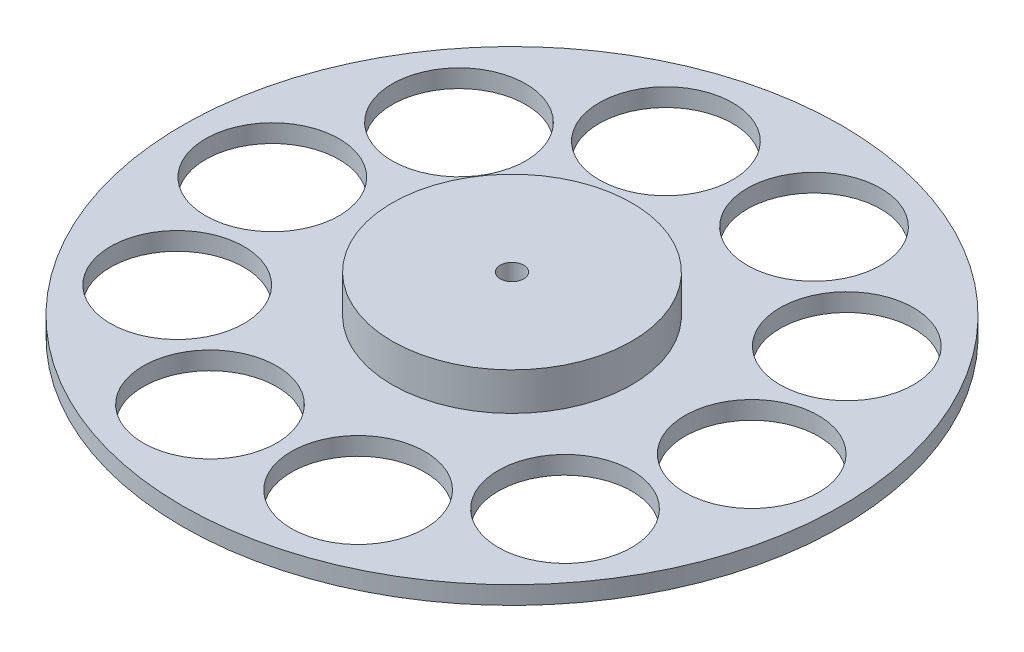
ISO-10303-21;
HEADER;
FILE_DESCRIPTION(('STEP AP214'),'2;1');
FILE_NAME('part.step','',(''),(''),'','','');
FILE_SCHEMA(('AUTOMOTIVE_DESIGN { 1 0 10303 214 1 1 1 1 }'));
ENDSEC;
DATA;
#1=APPLICATION_CONTEXT('core data for automotive mechanical design processes');
#2=APPLICATION_PROTOCOL_DEFINITION('international standard','automotive_design',2000,#1);
#3=PRODUCT_CONTEXT('',#1,'mechanical');
#4=PRODUCT('Part','Part','',(#3));
#5=PRODUCT_RELATED_PRODUCT_CATEGORY('part','',(#4));
#6=PRODUCT_DEFINITION_FORMATION('','',#4);
#7=PRODUCT_DEFINITION_CONTEXT('part definition',#1,'design');
#8=PRODUCT_DEFINITION('design','',#6,#7);
#9=PRODUCT_DEFINITION_SHAPE('','',#8);
#10=(LENGTH_UNIT() NAMED_UNIT(*) SI_UNIT(.MILLI.,.METRE.));
#11=(NAMED_UNIT(*) PLANE_ANGLE_UNIT() SI_UNIT($,.RADIAN.));
#12=(NAMED_UNIT(*) SI_UNIT($,.STERADIAN.) SOLID_ANGLE_UNIT());
#13=UNCERTAINTY_MEASURE_WITH_UNIT(LENGTH_MEASURE(1.E-05),#10,'distance_accuracy_value','');
#14=(GEOMETRIC_REPRESENTATION_CONTEXT(3) GLOBAL_UNCERTAINTY_ASSIGNED_CONTEXT((#13)) GLOBAL_UNIT_ASSIGNED_CONTEXT((#10,
#11,#12)) REPRESENTATION_CONTEXT('',''));
#15=CARTESIAN_POINT('',(0.,0.,0.));
#16=DIRECTION('',(0.,0.,1.));
#17=DIRECTION('',(1.,0.,0.));
#18=AXIS2_PLACEMENT_3D('',#15,#16,#17);
#19=CARTESIAN_POINT('',(0.,3.81,0.));
#20=DIRECTION('',(0.,-1.,0.));
#21=DIRECTION('',(0.,0.,-1.));
#22=AXIS2_PLACEMENT_3D('',#19,#20,#21);
#23=CYLINDRICAL_SURFACE('',#22,69.85);
#24=CARTESIAN_POINT('',(0.,3.81,0.));
#25=DIRECTION('',(0.,1.,0.));
#26=DIRECTION('',(0.,0.,1.));
#27=AXIS2_PLACEMENT_3D('',#24,#25,#26);
#28=CIRCLE('',#27,69.85);
#29=CARTESIAN_POINT('',(0.,3.81,-69.85));
#30=VERTEX_POINT('',#29);
#31=EDGE_CURVE('E68',#30,#30,#28,.T.);
#32=CARTESIAN_POINT('',(0.,0.,0.));
#33=DIRECTION('',(0.,1.,0.));
#34=DIRECTION('',(0.,0.,1.));
#35=AXIS2_PLACEMENT_3D('',#32,#33,#34);
#36=CIRCLE('',#35,69.85);
#37=CARTESIAN_POINT('',(0.,0.,-69.85));
#38=VERTEX_POINT('',#37);
#39=EDGE_CURVE('E65',#38,#38,#36,.T.);
#40=CARTESIAN_POINT('',(0.,3.81,-69.85));
#41=CARTESIAN_POINT('',(0.,3.7703125,-69.85));
#42=CARTESIAN_POINT('',(0.,3.730625,-69.85));
#43=CARTESIAN_POINT('',(0.,3.65125,-69.85));
#44=CARTESIAN_POINT('',(0.,3.6115625,-69.85));
#45=CARTESIAN_POINT('',(0.,3.5321875,-69.85));
#46=CARTESIAN_POINT('',(0.,3.4925,-69.85));
#47=CARTESIAN_POINT('',(0.,3.413125,-69.85));
#48=CARTESIAN_POINT('',(0.,3.3734375,-69.85));
#49=CARTESIAN_POINT('',(0.,3.2940625,-69.85));
#50=CARTESIAN_POINT('',(0.,3.254375,-69.85));
#51=CARTESIAN_POINT('',(0.,3.175,-69.85));
#52=CARTESIAN_POINT('',(0.,3.1353125,-69.85));
#53=CARTESIAN_POINT('',(0.,3.0559375,-69.85));
#54=CARTESIAN_POINT('',(0.,3.01625,-69.85));
#55=CARTESIAN_POINT('',(0.,2.936875,-69.85));
#56=CARTESIAN_POINT('',(0.,2.8971875,-69.85));
#57=CARTESIAN_POINT('',(0.,2.8178125,-69.85));
#58=CARTESIAN_POINT('',(0.,2.778125,-69.85));
#59=CARTESIAN_POINT('',(0.,2.69875,-69.85));
#60=CARTESIAN_POINT('',(0.,2.6590625,-69.85));
#61=CARTESIAN_POINT('',(0.,2.5796875,-69.85));
#62=CARTESIAN_POINT('',(0.,2.54,-69.85));
#63=CARTESIAN_POINT('',(0.,2.460625,-69.85));
#64=CARTESIAN_POINT('',(0.,2.4209375,-69.85));
#65=CARTESIAN_POINT('',(0.,2.3415625,-69.85));
#66=CARTESIAN_POINT('',(0.,2.301875,-69.85));
#67=CARTESIAN_POINT('',(0.,2.2225,-69.85));
#68=CARTESIAN_POINT('',(0.,2.1828125,-69.85));
#69=CARTESIAN_POINT('',(0.,2.1034375,-69.85));
#70=CARTESIAN_POINT('',(0.,2.06375,-69.85));
#71=CARTESIAN_POINT('',(0.,1.984375,-69.85));
#72=CARTESIAN_POINT('',(0.,1.9446875,-69.85));
#73=CARTESIAN_POINT('',(0.,1.8653125,-69.85));
#74=CARTESIAN_POINT('',(0.,1.825625,-69.85));
#75=CARTESIAN_POINT('',(0.,1.74625,-69.85));
#76=CARTESIAN_POINT('',(0.,1.7065625,-69.85));
#77=CARTESIAN_POINT('',(0.,1.6271875,-69.85));
#78=CARTESIAN_POINT('',(0.,1.5875,-69.85));
#79=CARTESIAN_POINT('',(0.,1.508125,-69.85));
#80=CARTESIAN_POINT('',(0.,1.4684375,-69.85));
#81=CARTESIAN_POINT('',(0.,1.3890625,-69.85));
#82=CARTESIAN_POINT('',(0.,1.349375,-69.85));
#83=CARTESIAN_POINT('',(0.,1.27,-69.85));
#84=CARTESIAN_POINT('',(0.,1.2303125,-69.85));
#85=CARTESIAN_POINT('',(0.,1.1509375,-69.85));
#86=CARTESIAN_POINT('',(0.,1.11125,-69.85));
#87=CARTESIAN_POINT('',(0.,1.031875,-69.85));
#88=CARTESIAN_POINT('',(0.,0.9921875,-69.85));
#89=CARTESIAN_POINT('',(0.,0.9128125,-69.85));
#90=CARTESIAN_POINT('',(0.,0.873125,-69.85));
#91=CARTESIAN_POINT('',(0.,0.79375,-69.85));
#92=CARTESIAN_POINT('',(0.,0.7540625,-69.85));
#93=CARTESIAN_POINT('',(0.,0.6746875,-69.85));
#94=CARTESIAN_POINT('',(0.,0.635,-69.85));
#95=CARTESIAN_POINT('',(0.,0.555625,-69.85));
#96=CARTESIAN_POINT('',(0.,0.5159375,-69.85));
#97=CARTESIAN_POINT('',(0.,0.4365625,-69.85));
#98=CARTESIAN_POINT('',(0.,0.396875,-69.85));
#99=CARTESIAN_POINT('',(0.,0.3175,-69.85));
#100=CARTESIAN_POINT('',(0.,0.2778125,-69.85));
#101=CARTESIAN_POINT('',(0.,0.1984375,-69.85));
#102=CARTESIAN_POINT('',(0.,0.15875,-69.85));
#103=CARTESIAN_POINT('',(0.,0.0793749999999999,-69.85));
#104=CARTESIAN_POINT('',(0.,0.0396874999999999,-69.85));
#105=CARTESIAN_POINT('',(0.,0.,-69.85));
#106=B_SPLINE_CURVE_WITH_KNOTS('',3,(#40,#41,#42,#43,#44,#45,#46,#47,#48,#49,#50,#51,#52,#53,
#54,#55,#56,#57,#58,#59,#60,#61,#62,#63,#64,#65,#66,#67,#68,#69,#70,#71,#72,#73,#74,#75,#76,#77,
#78,#79,#80,#81,#82,#83,#84,#85,#86,#87,#88,#89,#90,#91,#92,#93,#94,#95,#96,#97,#98,#99,#100,
#101,#102,#103,#104,#105),.UNSPECIFIED.,.F.,.F.,(4,2,2,2,2,2,2,2,2,2,2,2,2,2,2,2,2,2,2,2,2,2,2,
2,2,2,2,2,2,2,2,2,4),(0.,0.1190625,0.238125,0.3571875,0.47625,0.5953125,0.714375,0.8334375,
0.9525,1.0715625,1.190625,1.3096875,1.42875,1.5478125,1.666875,1.7859375,1.905,2.0240625,
2.143125,2.2621875,2.38125,2.5003125,2.619375,2.7384375,2.8575,2.9765625,3.095625,3.2146875,
3.33375,3.4528125,3.571875,3.6909375,3.81),.UNSPECIFIED.);
#107=EDGE_CURVE('BSEAM35',#30,#38,#106,.T.);
#108=ORIENTED_EDGE('',*,*,#31,.F.);
#109=ORIENTED_EDGE('',*,*,#39,.T.);
#110=ORIENTED_EDGE('',*,*,#107,.T.);
#111=ORIENTED_EDGE('',*,*,#107,.F.);
#112=EDGE_LOOP('',(#108,#110,#109,#111));
#113=FACE_BOUND('',#112,.T.);
#114=ADVANCED_FACE('F35',(#113),#23,.T.);
#115=CARTESIAN_POINT('',(0.,3.81,0.));
#116=DIRECTION('',(0.,1.,0.));
#117=DIRECTION('',(0.,0.,1.));
#118=AXIS2_PLACEMENT_3D('',#115,#116,#117);
#119=PLANE('',#118);
#120=CARTESIAN_POINT('',(-50.8,3.81,0.));
#121=DIRECTION('',(0.,1.,0.));
#122=DIRECTION('',(0.,0.,1.));
#123=AXIS2_PLACEMENT_3D('',#120,#121,#122);
#124=CIRCLE('',#123,14.15);
#125=CARTESIAN_POINT('',(-50.8,3.81,14.15));
#126=VERTEX_POINT('',#125);
#127=EDGE_CURVE('E360',#126,#126,#124,.T.);
#128=ORIENTED_EDGE('',*,*,#127,.F.);
#129=EDGE_LOOP('',(#128));
#130=FACE_BOUND('',#129,.T.);
#131=CARTESIAN_POINT('',(-41.0980633142479,3.81,-29.8594908164589));
#132=DIRECTION('',(0.,1.,0.));
#133=DIRECTION('',(0.,0.,1.));
#134=AXIS2_PLACEMENT_3D('',#131,#132,#133);
#135=CIRCLE('',#134,14.15);
#136=CARTESIAN_POINT('',(-41.0980633142479,3.81,-15.7094908164588));
#137=VERTEX_POINT('',#136);
#138=EDGE_CURVE('E362',#137,#137,#135,.T.);
#139=ORIENTED_EDGE('',*,*,#138,.F.);
#140=EDGE_LOOP('',(#139));
#141=FACE_BOUND('',#140,.T.);
#142=CARTESIAN_POINT('',(-15.6980633142476,3.81,-48.3136710277963));
#143=DIRECTION('',(0.,1.,0.));
#144=DIRECTION('',(0.,0.,1.));
#145=AXIS2_PLACEMENT_3D('',#142,#143,#144);
#146=CIRCLE('',#145,14.15);
#147=CARTESIAN_POINT('',(-15.6980633142476,3.81,-34.1636710277963));
#148=VERTEX_POINT('',#147);
#149=EDGE_CURVE('E370',#148,#148,#146,.T.);
#150=ORIENTED_EDGE('',*,*,#149,.F.);
#151=EDGE_LOOP('',(#150));
#152=FACE_BOUND('',#151,.T.);
#153=CARTESIAN_POINT('',(15.6980633142481,3.81,-48.3136710277972));
#154=DIRECTION('',(0.,1.,0.));
#155=DIRECTION('',(0.,0.,1.));
#156=AXIS2_PLACEMENT_3D('',#153,#154,#155);
#157=CIRCLE('',#156,14.15);
#158=CARTESIAN_POINT('',(15.6980633142481,3.81,-34.1636710277972));
#159=VERTEX_POINT('',#158);
#160=EDGE_CURVE('E99',#159,#159,#157,.T.);
#161=ORIENTED_EDGE('',*,*,#160,.F.);
#162=EDGE_LOOP('',(#161));
#163=FACE_BOUND('',#162,.T.);
#164=CARTESIAN_POINT('',(41.0980633142494,3.81,-29.8594908164612));
#165=DIRECTION('',(0.,1.,0.));
#166=DIRECTION('',(0.,0.,1.));
#167=AXIS2_PLACEMENT_3D('',#164,#165,#166);
#168=CIRCLE('',#167,14.15);
#169=CARTESIAN_POINT('',(41.0980633142494,3.81,-15.7094908164612));
#170=VERTEX_POINT('',#169);
#171=EDGE_CURVE('E88',#170,#170,#168,.T.);
#172=ORIENTED_EDGE('',*,*,#171,.F.);
#173=EDGE_LOOP('',(#172));
#174=FACE_BOUND('',#173,.T.);
#175=CARTESIAN_POINT('',(50.8000000000032,3.81,-2.86576318231369E-12));
#176=DIRECTION('',(0.,1.,0.));
#177=DIRECTION('',(0.,0.,1.));
#178=AXIS2_PLACEMENT_3D('',#175,#176,#177);
#179=CIRCLE('',#178,14.15);
#180=CARTESIAN_POINT('',(50.8000000000032,3.81,14.1499999999971));
#181=VERTEX_POINT('',#180);
#182=EDGE_CURVE('E85',#181,#181,#179,.T.);
#183=ORIENTED_EDGE('',*,*,#182,.F.);
#184=EDGE_LOOP('',(#183));
#185=FACE_BOUND('',#184,.T.);
#186=CARTESIAN_POINT('',(41.0980633142511,3.81,29.859490816456));
#187=DIRECTION('',(0.,1.,0.));
#188=DIRECTION('',(0.,0.,1.));
#189=AXIS2_PLACEMENT_3D('',#186,#187,#188);
#190=CIRCLE('',#189,14.15);
#191=CARTESIAN_POINT('',(41.0980633142511,3.81,44.009490816456));
#192=VERTEX_POINT('',#191);
#193=EDGE_CURVE('E82',#192,#192,#190,.T.);
#194=ORIENTED_EDGE('',*,*,#193,.F.);
#195=EDGE_LOOP('',(#194));
#196=FACE_BOUND('',#195,.T.);
#197=CARTESIAN_POINT('',(15.6980633142508,3.81,48.3136710277935));
#198=DIRECTION('',(0.,1.,0.));
#199=DIRECTION('',(0.,0.,1.));
#200=AXIS2_PLACEMENT_3D('',#197,#198,#199);
#201=CIRCLE('',#200,14.15);
#202=CARTESIAN_POINT('',(15.6980633142508,3.81,62.4636710277935));
#203=VERTEX_POINT('',#202);
#204=EDGE_CURVE('E81',#203,#203,#201,.T.);
#205=ORIENTED_EDGE('',*,*,#204,.F.);
#206=EDGE_LOOP('',(#205));
#207=FACE_BOUND('',#206,.T.);
#208=CARTESIAN_POINT('',(-15.6980633142448,3.81,48.3136710277943));
#209=DIRECTION('',(0.,1.,0.));
#210=DIRECTION('',(0.,0.,1.));
#211=AXIS2_PLACEMENT_3D('',#208,#209,#210);
#212=CIRCLE('',#211,14.15);
#213=CARTESIAN_POINT('',(-15.6980633142448,3.81,62.4636710277944));
#214=VERTEX_POINT('',#213);
#215=EDGE_CURVE('E77',#214,#214,#212,.T.);
#216=ORIENTED_EDGE('',*,*,#215,.F.);
#217=EDGE_LOOP('',(#216));
#218=FACE_BOUND('',#217,.T.);
#219=CARTESIAN_POINT('',(-41.0980633142462,3.81,29.8594908164583));
#220=DIRECTION('',(0.,1.,0.));
#221=DIRECTION('',(0.,0.,1.));
#222=AXIS2_PLACEMENT_3D('',#219,#220,#221);
#223=CIRCLE('',#222,14.15);
#224=CARTESIAN_POINT('',(-41.0980633142462,3.81,44.0094908164583));
#225=VERTEX_POINT('',#224);
#226=EDGE_CURVE('E76',#225,#225,#223,.T.);
#227=ORIENTED_EDGE('',*,*,#226,.F.);
#228=EDGE_LOOP('',(#227));
#229=FACE_BOUND('',#228,.T.);
#230=CARTESIAN_POINT('',(0.,3.81,0.));
#231=DIRECTION('',(0.,1.,0.));
#232=DIRECTION('',(0.,0.,1.));
#233=AXIS2_PLACEMENT_3D('',#230,#231,#232);
#234=CIRCLE('',#233,25.4);
#235=CARTESIAN_POINT('',(0.,3.81,25.4));
#236=VERTEX_POINT('',#235);
#237=EDGE_CURVE('E47',#236,#236,#234,.T.);
#238=ORIENTED_EDGE('',*,*,#237,.F.);
#239=EDGE_LOOP('',(#238));
#240=FACE_BOUND('',#239,.T.);
#241=ORIENTED_EDGE('',*,*,#31,.T.);
#242=EDGE_LOOP('',(#241));
#243=FACE_BOUND('',#242,.T.);
#244=ADVANCED_FACE('F143',(#130,#141,#152,#163,#174,#185,#196,#207,#218,#229,#240,#243),#119,.T.);
#245=CARTESIAN_POINT('',(0.,0.,0.));
#246=DIRECTION('',(0.,1.,0.));
#247=DIRECTION('',(0.,0.,1.));
#248=AXIS2_PLACEMENT_3D('',#245,#246,#247);
#249=PLANE('',#248);
#250=CARTESIAN_POINT('',(-50.8,0.,0.));
#251=DIRECTION('',(0.,1.,0.));
#252=DIRECTION('',(0.,0.,1.));
#253=AXIS2_PLACEMENT_3D('',#250,#251,#252);
#254=CIRCLE('',#253,14.15);
#255=CARTESIAN_POINT('',(-50.8,0.,14.15));
#256=VERTEX_POINT('',#255);
#257=EDGE_CURVE('E38',#256,#256,#254,.T.);
#258=ORIENTED_EDGE('',*,*,#257,.T.);
#259=EDGE_LOOP('',(#258));
#260=FACE_BOUND('',#259,.T.);
#261=CARTESIAN_POINT('',(-41.0980633142479,0.,-29.8594908164589));
#262=DIRECTION('',(0.,1.,0.));
#263=DIRECTION('',(0.,0.,1.));
#264=AXIS2_PLACEMENT_3D('',#261,#262,#263);
#265=CIRCLE('',#264,14.15);
#266=CARTESIAN_POINT('',(-41.0980633142479,0.,-15.7094908164588));
#267=VERTEX_POINT('',#266);
#268=EDGE_CURVE('E364',#267,#267,#265,.T.);
#269=ORIENTED_EDGE('',*,*,#268,.T.);
#270=EDGE_LOOP('',(#269));
#271=FACE_BOUND('',#270,.T.);
#272=CARTESIAN_POINT('',(-15.6980633142476,0.,-48.3136710277963));
#273=DIRECTION('',(0.,1.,0.));
#274=DIRECTION('',(0.,0.,1.));
#275=AXIS2_PLACEMENT_3D('',#272,#273,#274);
#276=CIRCLE('',#275,14.15);
#277=CARTESIAN_POINT('',(-15.6980633142476,0.,-34.1636710277963));
#278=VERTEX_POINT('',#277);
#279=EDGE_CURVE('E373',#278,#278,#276,.T.);
#280=ORIENTED_EDGE('',*,*,#279,.T.);
#281=EDGE_LOOP('',(#280));
#282=FACE_BOUND('',#281,.T.);
#283=CARTESIAN_POINT('',(15.6980633142481,0.,-48.3136710277972));
#284=DIRECTION('',(0.,1.,0.));
#285=DIRECTION('',(0.,0.,1.));
#286=AXIS2_PLACEMENT_3D('',#283,#284,#285);
#287=CIRCLE('',#286,14.15);
#288=CARTESIAN_POINT('',(15.6980633142481,0.,-34.1636710277972));
#289=VERTEX_POINT('',#288);
#290=EDGE_CURVE('E94',#289,#289,#287,.T.);
#291=ORIENTED_EDGE('',*,*,#290,.T.);
#292=EDGE_LOOP('',(#291));
#293=FACE_BOUND('',#292,.T.);
#294=CARTESIAN_POINT('',(41.0980633142494,0.,-29.8594908164612));
#295=DIRECTION('',(0.,1.,0.));
#296=DIRECTION('',(0.,0.,1.));
#297=AXIS2_PLACEMENT_3D('',#294,#295,#296);
#298=CIRCLE('',#297,14.15);
#299=CARTESIAN_POINT('',(41.0980633142494,0.,-15.7094908164612));
#300=VERTEX_POINT('',#299);
#301=EDGE_CURVE('E86',#300,#300,#298,.T.);
#302=ORIENTED_EDGE('',*,*,#301,.T.);
#303=EDGE_LOOP('',(#302));
#304=FACE_BOUND('',#303,.T.);
#305=CARTESIAN_POINT('',(50.8000000000032,0.,-2.86576318231369E-12));
#306=DIRECTION('',(0.,1.,0.));
#307=DIRECTION('',(0.,0.,1.));
#308=AXIS2_PLACEMENT_3D('',#305,#306,#307);
#309=CIRCLE('',#308,14.15);
#310=CARTESIAN_POINT('',(50.8000000000032,0.,14.1499999999971));
#311=VERTEX_POINT('',#310);
#312=EDGE_CURVE('E83',#311,#311,#309,.T.);
#313=ORIENTED_EDGE('',*,*,#312,.T.);
#314=EDGE_LOOP('',(#313));
#315=FACE_BOUND('',#314,.T.);
#316=CARTESIAN_POINT('',(41.0980633142511,0.,29.859490816456));
#317=DIRECTION('',(0.,1.,0.));
#318=DIRECTION('',(0.,0.,1.));
#319=AXIS2_PLACEMENT_3D('',#316,#317,#318);
#320=CIRCLE('',#319,14.15);
#321=CARTESIAN_POINT('',(41.0980633142511,0.,44.009490816456));
#322=VERTEX_POINT('',#321);
#323=EDGE_CURVE('E78',#322,#322,#320,.T.);
#324=ORIENTED_EDGE('',*,*,#323,.T.);
#325=EDGE_LOOP('',(#324));
#326=FACE_BOUND('',#325,.T.);
#327=CARTESIAN_POINT('',(15.6980633142508,0.,48.3136710277935));
#328=DIRECTION('',(0.,1.,0.));
#329=DIRECTION('',(0.,0.,1.));
#330=AXIS2_PLACEMENT_3D('',#327,#328,#329);
#331=CIRCLE('',#330,14.15);
#332=CARTESIAN_POINT('',(15.6980633142508,0.,62.4636710277935));
#333=VERTEX_POINT('',#332);
#334=EDGE_CURVE('E107',#333,#333,#331,.T.);
#335=ORIENTED_EDGE('',*,*,#334,.T.);
#336=EDGE_LOOP('',(#335));
#337=FACE_BOUND('',#336,.T.);
#338=CARTESIAN_POINT('',(-15.6980633142448,0.,48.3136710277943));
#339=DIRECTION('',(0.,1.,0.));
#340=DIRECTION('',(0.,0.,1.));
#341=AXIS2_PLACEMENT_3D('',#338,#339,#340);
#342=CIRCLE('',#341,14.15);
#343=CARTESIAN_POINT('',(-15.6980633142448,0.,62.4636710277944));
#344=VERTEX_POINT('',#343);
#345=EDGE_CURVE('E73',#344,#344,#342,.T.);
#346=ORIENTED_EDGE('',*,*,#345,.T.);
#347=EDGE_LOOP('',(#346));
#348=FACE_BOUND('',#347,.T.);
#349=CARTESIAN_POINT('',(-41.0980633142462,0.,29.8594908164583));
#350=DIRECTION('',(0.,1.,0.));
#351=DIRECTION('',(0.,0.,1.));
#352=AXIS2_PLACEMENT_3D('',#349,#350,#351);
#353=CIRCLE('',#352,14.15);
#354=CARTESIAN_POINT('',(-41.0980633142462,0.,44.0094908164583));
#355=VERTEX_POINT('',#354);
#356=EDGE_CURVE('E114',#355,#355,#353,.T.);
#357=ORIENTED_EDGE('',*,*,#356,.T.);
#358=EDGE_LOOP('',(#357));
#359=FACE_BOUND('',#358,.T.);
#360=CARTESIAN_POINT('',(0.,0.,0.));
#361=DIRECTION('',(0.,-1.,0.));
#362=DIRECTION('',(0.,0.,-1.));
#363=AXIS2_PLACEMENT_3D('',#360,#361,#362);
#364=CIRCLE('',#363,11.43);
#365=CARTESIAN_POINT('',(0.,0.,-11.43));
#366=VERTEX_POINT('',#365);
#367=EDGE_CURVE('E56',#366,#366,#364,.T.);
#368=ORIENTED_EDGE('',*,*,#367,.F.);
#369=EDGE_LOOP('',(#368));
#370=FACE_BOUND('',#369,.T.);
#371=ORIENTED_EDGE('',*,*,#39,.F.);
#372=EDGE_LOOP('',(#371));
#373=FACE_BOUND('',#372,.T.);
#374=ADVANCED_FACE('F148',(#260,#271,#282,#293,#304,#315,#326,#337,#348,#359,#370,#373),#249,.F.);
#375=CARTESIAN_POINT('',(0.,11.80999997,0.));
#376=DIRECTION('',(0.,-1.,0.));
#377=DIRECTION('',(0.,0.,-1.));
#378=AXIS2_PLACEMENT_3D('',#375,#376,#377);
#379=CYLINDRICAL_SURFACE('',#378,25.4);
#380=CARTESIAN_POINT('',(0.,11.80999997,0.));
#381=DIRECTION('',(0.,1.,0.));
#382=DIRECTION('',(0.,0.,1.));
#383=AXIS2_PLACEMENT_3D('',#380,#381,#382);
#384=CIRCLE('',#383,25.4);
#385=CARTESIAN_POINT('',(0.,11.80999997,25.4));
#386=VERTEX_POINT('',#385);
#387=EDGE_CURVE('E60',#386,#386,#384,.T.);
#388=ORIENTED_EDGE('',*,*,#387,.F.);
#389=EDGE_LOOP('',(#388));
#390=FACE_BOUND('',#389,.T.);
#391=ORIENTED_EDGE('',*,*,#237,.T.);
#392=EDGE_LOOP('',(#391));
#393=FACE_BOUND('',#392,.T.);
#394=ADVANCED_FACE('F156',(#390,#393),#379,.T.);
#395=CARTESIAN_POINT('',(0.,11.80999997,0.));
#396=DIRECTION('',(0.,1.,0.));
#397=DIRECTION('',(0.,0.,1.));
#398=AXIS2_PLACEMENT_3D('',#395,#396,#397);
#399=PLANE('',#398);
#400=CARTESIAN_POINT('',(0.,11.80999997,0.));
#401=DIRECTION('',(0.,-1.,0.));
#402=DIRECTION('',(0.,0.,-1.));
#403=AXIS2_PLACEMENT_3D('',#400,#401,#402);
#404=CIRCLE('',#403,2.5);
#405=CARTESIAN_POINT('',(0.,11.80999997,-2.5));
#406=VERTEX_POINT('',#405);
#407=EDGE_CURVE('E119',#406,#406,#404,.T.);
#408=ORIENTED_EDGE('',*,*,#407,.T.);
#409=EDGE_LOOP('',(#408));
#410=FACE_BOUND('',#409,.T.);
#411=ORIENTED_EDGE('',*,*,#387,.T.);
#412=EDGE_LOOP('',(#411));
#413=FACE_BOUND('',#412,.T.);
#414=ADVANCED_FACE('F161',(#410,#413),#399,.T.);
#415=CARTESIAN_POINT('',(0.,3.99999997,0.));
#416=DIRECTION('',(0.,-1.,0.));
#417=DIRECTION('',(0.,0.,-1.));
#418=AXIS2_PLACEMENT_3D('',#415,#416,#417);
#419=CYLINDRICAL_SURFACE('',#418,11.43);
#420=CARTESIAN_POINT('',(0.,3.99999997,0.));
#421=DIRECTION('',(0.,-1.,0.));
#422=DIRECTION('',(0.,0.,-1.));
#423=AXIS2_PLACEMENT_3D('',#420,#421,#422);
#424=CIRCLE('',#423,11.43);
#425=CARTESIAN_POINT('',(0.,3.99999997,-11.43));
#426=VERTEX_POINT('',#425);
#427=EDGE_CURVE('E57',#426,#426,#424,.T.);
#428=ORIENTED_EDGE('',*,*,#427,.F.);
#429=EDGE_LOOP('',(#428));
#430=FACE_BOUND('',#429,.T.);
#431=ORIENTED_EDGE('',*,*,#367,.T.);
#432=EDGE_LOOP('',(#431));
#433=FACE_BOUND('',#432,.T.);
#434=ADVANCED_FACE('F169',(#430,#433),#419,.F.);
#435=CARTESIAN_POINT('',(0.,3.99999997,0.));
#436=DIRECTION('',(0.,-1.,0.));
#437=DIRECTION('',(0.,0.,-1.));
#438=AXIS2_PLACEMENT_3D('',#435,#436,#437);
#439=PLANE('',#438);
#440=CARTESIAN_POINT('',(0.,3.99999997,0.));
#441=DIRECTION('',(0.,-1.,0.));
#442=DIRECTION('',(0.,0.,-1.));
#443=AXIS2_PLACEMENT_3D('',#440,#441,#442);
#444=CIRCLE('',#443,6.);
#445=CARTESIAN_POINT('',(0.,3.99999997,-6.));
#446=VERTEX_POINT('',#445);
#447=EDGE_CURVE('E42',#446,#446,#444,.T.);
#448=ORIENTED_EDGE('',*,*,#447,.F.);
#449=EDGE_LOOP('',(#448));
#450=FACE_BOUND('',#449,.T.);
#451=ORIENTED_EDGE('',*,*,#427,.T.);
#452=EDGE_LOOP('',(#451));
#453=FACE_BOUND('',#452,.T.);
#454=ADVANCED_FACE('F172',(#450,#453),#439,.T.);
#455=CARTESIAN_POINT('',(0.,3.49199997,0.));
#456=DIRECTION('',(0.,1.,0.));
#457=DIRECTION('',(0.,0.,1.));
#458=AXIS2_PLACEMENT_3D('',#455,#456,#457);
#459=CYLINDRICAL_SURFACE('',#458,6.);
#460=CARTESIAN_POINT('',(0.,3.49199997,0.));
#461=DIRECTION('',(0.,1.,0.));
#462=DIRECTION('',(0.,0.,1.));
#463=AXIS2_PLACEMENT_3D('',#460,#461,#462);
#464=CIRCLE('',#463,6.);
#465=CARTESIAN_POINT('',(0.,3.49199997,6.));
#466=VERTEX_POINT('',#465);
#467=EDGE_CURVE('E53',#466,#466,#464,.T.);
#468=ORIENTED_EDGE('',*,*,#467,.T.);
#469=EDGE_LOOP('',(#468));
#470=FACE_BOUND('',#469,.T.);
#471=ORIENTED_EDGE('',*,*,#447,.T.);
#472=EDGE_LOOP('',(#471));
#473=FACE_BOUND('',#472,.T.);
#474=ADVANCED_FACE('F139',(#470,#473),#459,.T.);
#475=CARTESIAN_POINT('',(0.,3.49199997,0.));
#476=DIRECTION('',(0.,1.,0.));
#477=DIRECTION('',(0.,0.,1.));
#478=AXIS2_PLACEMENT_3D('',#475,#476,#477);
#479=PLANE('',#478);
#480=CARTESIAN_POINT('',(0.,3.49199997,0.));
#481=DIRECTION('',(0.,-1.,0.));
#482=DIRECTION('',(0.,0.,-1.));
#483=AXIS2_PLACEMENT_3D('',#480,#481,#482);
#484=CIRCLE('',#483,3.95);
#485=CARTESIAN_POINT('',(0.,3.49199997,-3.95));
#486=VERTEX_POINT('',#485);
#487=EDGE_CURVE('E10',#486,#486,#484,.T.);
#488=ORIENTED_EDGE('',*,*,#487,.F.);
#489=EDGE_LOOP('',(#488));
#490=FACE_BOUND('',#489,.T.);
#491=ORIENTED_EDGE('',*,*,#467,.F.);
#492=EDGE_LOOP('',(#491));
#493=FACE_BOUND('',#492,.T.);
#494=ADVANCED_FACE('F130',(#490,#493),#479,.F.);
#495=CARTESIAN_POINT('',(0.,-1.50800003,0.));
#496=DIRECTION('',(0.,1.,0.));
#497=DIRECTION('',(0.,0.,1.));
#498=AXIS2_PLACEMENT_3D('',#495,#496,#497);
#499=CYLINDRICAL_SURFACE('',#498,3.95);
#500=CARTESIAN_POINT('',(0.,-1.50800003,0.));
#501=DIRECTION('',(0.,-1.,0.));
#502=DIRECTION('',(0.,0.,-1.));
#503=AXIS2_PLACEMENT_3D('',#500,#501,#502);
#504=CIRCLE('',#503,3.95);
#505=CARTESIAN_POINT('',(0.,-1.50800003,-3.95));
#506=VERTEX_POINT('',#505);
#507=EDGE_CURVE('E51',#506,#506,#504,.T.);
#508=ORIENTED_EDGE('',*,*,#507,.F.);
#509=EDGE_LOOP('',(#508));
#510=FACE_BOUND('',#509,.T.);
#511=ORIENTED_EDGE('',*,*,#487,.T.);
#512=EDGE_LOOP('',(#511));
#513=FACE_BOUND('',#512,.T.);
#514=ADVANCED_FACE('F128',(#510,#513),#499,.T.);
#515=CARTESIAN_POINT('',(0.,-1.50800003,0.));
#516=DIRECTION('',(0.,-1.,0.));
#517=DIRECTION('',(0.,0.,-1.));
#518=AXIS2_PLACEMENT_3D('',#515,#516,#517);
#519=PLANE('',#518);
#520=CARTESIAN_POINT('',(0.,-1.50800003,0.));
#521=DIRECTION('',(0.,-1.,0.));
#522=DIRECTION('',(0.,0.,-1.));
#523=AXIS2_PLACEMENT_3D('',#520,#521,#522);
#524=CIRCLE('',#523,2.5);
#525=CARTESIAN_POINT('',(0.,-1.50800003,-2.5));
#526=VERTEX_POINT('',#525);
#527=EDGE_CURVE('E117',#526,#526,#524,.T.);
#528=ORIENTED_EDGE('',*,*,#527,.F.);
#529=EDGE_LOOP('',(#528));
#530=FACE_BOUND('',#529,.T.);
#531=ORIENTED_EDGE('',*,*,#507,.T.);
#532=EDGE_LOOP('',(#531));
#533=FACE_BOUND('',#532,.T.);
#534=ADVANCED_FACE('F126',(#530,#533),#519,.T.);
#535=CARTESIAN_POINT('',(0.,11.80999997,0.));
#536=DIRECTION('',(0.,-1.,0.));
#537=DIRECTION('',(0.,0.,-1.));
#538=AXIS2_PLACEMENT_3D('',#535,#536,#537);
#539=CYLINDRICAL_SURFACE('',#538,2.5);
#540=ORIENTED_EDGE('',*,*,#407,.F.);
#541=EDGE_LOOP('',(#540));
#542=FACE_BOUND('',#541,.T.);
#543=ORIENTED_EDGE('',*,*,#527,.T.);
#544=EDGE_LOOP('',(#543));
#545=FACE_BOUND('',#544,.T.);
#546=ADVANCED_FACE('F136',(#542,#545),#539,.F.);
#547=CARTESIAN_POINT('',(-41.0980633142462,3.81,29.8594908164583));
#548=DIRECTION('',(0.,1.,0.));
#549=DIRECTION('',(0.,0.,1.));
#550=AXIS2_PLACEMENT_3D('',#547,#548,#549);
#551=CYLINDRICAL_SURFACE('',#550,14.15);
#552=ORIENTED_EDGE('',*,*,#226,.T.);
#553=EDGE_LOOP('',(#552));
#554=FACE_BOUND('',#553,.T.);
#555=ORIENTED_EDGE('',*,*,#356,.F.);
#556=EDGE_LOOP('',(#555));
#557=FACE_BOUND('',#556,.T.);
#558=ADVANCED_FACE('F223',(#554,#557),#551,.F.);
#559=CARTESIAN_POINT('',(-15.6980633142448,3.81,48.3136710277943));
#560=DIRECTION('',(0.,1.,0.));
#561=DIRECTION('',(0.,0.,1.));
#562=AXIS2_PLACEMENT_3D('',#559,#560,#561);
#563=CYLINDRICAL_SURFACE('',#562,14.15);
#564=ORIENTED_EDGE('',*,*,#215,.T.);
#565=EDGE_LOOP('',(#564));
#566=FACE_BOUND('',#565,.T.);
#567=ORIENTED_EDGE('',*,*,#345,.F.);
#568=EDGE_LOOP('',(#567));
#569=FACE_BOUND('',#568,.T.);
#570=ADVANCED_FACE('F245',(#566,#569),#563,.F.);
#571=CARTESIAN_POINT('',(15.6980633142508,3.81,48.3136710277935));
#572=DIRECTION('',(0.,1.,0.));
#573=DIRECTION('',(0.,0.,1.));
#574=AXIS2_PLACEMENT_3D('',#571,#572,#573);
#575=CYLINDRICAL_SURFACE('',#574,14.15);
#576=ORIENTED_EDGE('',*,*,#204,.T.);
#577=EDGE_LOOP('',(#576));
#578=FACE_BOUND('',#577,.T.);
#579=ORIENTED_EDGE('',*,*,#334,.F.);
#580=EDGE_LOOP('',(#579));
#581=FACE_BOUND('',#580,.T.);
#582=ADVANCED_FACE('F256',(#578,#581),#575,.F.);
#583=CARTESIAN_POINT('',(41.0980633142511,3.81,29.859490816456));
#584=DIRECTION('',(0.,1.,0.));
#585=DIRECTION('',(0.,0.,1.));
#586=AXIS2_PLACEMENT_3D('',#583,#584,#585);
#587=CYLINDRICAL_SURFACE('',#586,14.15);
#588=ORIENTED_EDGE('',*,*,#193,.T.);
#589=EDGE_LOOP('',(#588));
#590=FACE_BOUND('',#589,.T.);
#591=ORIENTED_EDGE('',*,*,#323,.F.);
#592=EDGE_LOOP('',(#591));
#593=FACE_BOUND('',#592,.T.);
#594=ADVANCED_FACE('F267',(#590,#593),#587,.F.);
#595=CARTESIAN_POINT('',(50.8000000000032,3.81,-2.86576318231369E-12));
#596=DIRECTION('',(0.,1.,0.));
#597=DIRECTION('',(0.,0.,1.));
#598=AXIS2_PLACEMENT_3D('',#595,#596,#597);
#599=CYLINDRICAL_SURFACE('',#598,14.15);
#600=ORIENTED_EDGE('',*,*,#182,.T.);
#601=EDGE_LOOP('',(#600));
#602=FACE_BOUND('',#601,.T.);
#603=ORIENTED_EDGE('',*,*,#312,.F.);
#604=EDGE_LOOP('',(#603));
#605=FACE_BOUND('',#604,.T.);
#606=ADVANCED_FACE('F278',(#602,#605),#599,.F.);
#607=CARTESIAN_POINT('',(41.0980633142494,3.81,-29.8594908164612));
#608=DIRECTION('',(0.,1.,0.));
#609=DIRECTION('',(0.,0.,1.));
#610=AXIS2_PLACEMENT_3D('',#607,#608,#609);
#611=CYLINDRICAL_SURFACE('',#610,14.15);
#612=ORIENTED_EDGE('',*,*,#171,.T.);
#613=EDGE_LOOP('',(#612));
#614=FACE_BOUND('',#613,.T.);
#615=ORIENTED_EDGE('',*,*,#301,.F.);
#616=EDGE_LOOP('',(#615));
#617=FACE_BOUND('',#616,.T.);
#618=ADVANCED_FACE('F289',(#614,#617),#611,.F.);
#619=CARTESIAN_POINT('',(15.6980633142481,3.81,-48.3136710277972));
#620=DIRECTION('',(0.,1.,0.));
#621=DIRECTION('',(0.,0.,1.));
#622=AXIS2_PLACEMENT_3D('',#619,#620,#621);
#623=CYLINDRICAL_SURFACE('',#622,14.15);
#624=ORIENTED_EDGE('',*,*,#160,.T.);
#625=EDGE_LOOP('',(#624));
#626=FACE_BOUND('',#625,.T.);
#627=ORIENTED_EDGE('',*,*,#290,.F.);
#628=EDGE_LOOP('',(#627));
#629=FACE_BOUND('',#628,.T.);
#630=ADVANCED_FACE('F300',(#626,#629),#623,.F.);
#631=CARTESIAN_POINT('',(-15.6980633142476,3.81,-48.3136710277963));
#632=DIRECTION('',(0.,1.,0.));
#633=DIRECTION('',(0.,0.,1.));
#634=AXIS2_PLACEMENT_3D('',#631,#632,#633);
#635=CYLINDRICAL_SURFACE('',#634,14.15);
#636=ORIENTED_EDGE('',*,*,#149,.T.);
#637=EDGE_LOOP('',(#636));
#638=FACE_BOUND('',#637,.T.);
#639=ORIENTED_EDGE('',*,*,#279,.F.);
#640=EDGE_LOOP('',(#639));
#641=FACE_BOUND('',#640,.T.);
#642=ADVANCED_FACE('F310',(#638,#641),#635,.F.);
#643=CARTESIAN_POINT('',(-41.0980633142479,3.81,-29.8594908164589));
#644=DIRECTION('',(0.,1.,0.));
#645=DIRECTION('',(0.,0.,1.));
#646=AXIS2_PLACEMENT_3D('',#643,#644,#645);
#647=CYLINDRICAL_SURFACE('',#646,14.15);
#648=ORIENTED_EDGE('',*,*,#138,.T.);
#649=EDGE_LOOP('',(#648));
#650=FACE_BOUND('',#649,.T.);
#651=ORIENTED_EDGE('',*,*,#268,.F.);
#652=EDGE_LOOP('',(#651));
#653=FACE_BOUND('',#652,.T.);
#654=ADVANCED_FACE('F321',(#650,#653),#647,.F.);
#655=CARTESIAN_POINT('',(-50.8,3.81,0.));
#656=DIRECTION('',(0.,1.,0.));
#657=DIRECTION('',(0.,0.,1.));
#658=AXIS2_PLACEMENT_3D('',#655,#656,#657);
#659=CYLINDRICAL_SURFACE('',#658,14.15);
#660=ORIENTED_EDGE('',*,*,#127,.T.);
#661=EDGE_LOOP('',(#660));
#662=FACE_BOUND('',#661,.T.);
#663=ORIENTED_EDGE('',*,*,#257,.F.);
#664=EDGE_LOOP('',(#663));
#665=FACE_BOUND('',#664,.T.);
#666=ADVANCED_FACE('F332',(#662,#665),#659,.F.);
#667=CLOSED_SHELL('',(#114,#244,#374,#394,#414,#434,#454,#474,#494,#514,#534,#546,#558,#570,
#582,#594,#606,#618,#630,#642,#654,#666));
#668=MANIFOLD_SOLID_BREP('B2',#667);
#669=ADVANCED_BREP_SHAPE_REPRESENTATION('',(#18,#668),#14);
#670=SHAPE_DEFINITION_REPRESENTATION(#9,#669);
ENDSEC;
END-ISO-10303-21;
